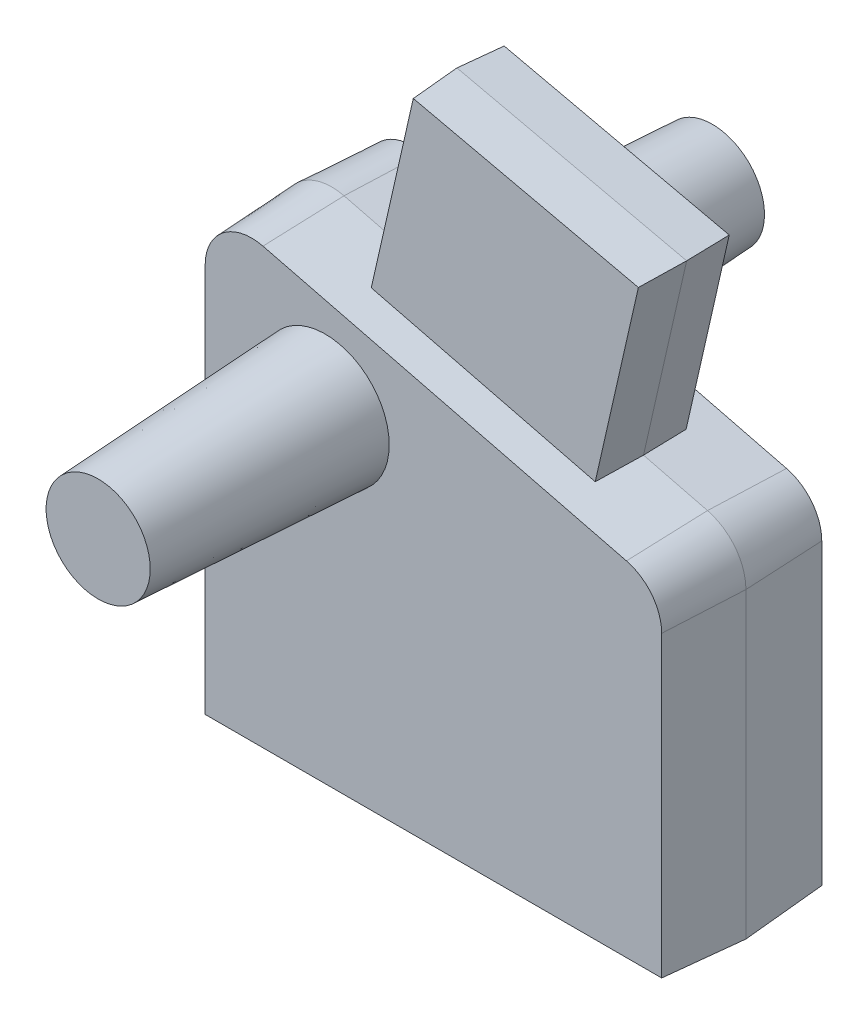
ISO-10303-21;
HEADER;
FILE_DESCRIPTION(('STEP AP214'),'2;1');
FILE_NAME('part.step','',(''),(''),'','','');
FILE_SCHEMA(('AUTOMOTIVE_DESIGN { 1 0 10303 214 1 1 1 1 }'));
ENDSEC;
DATA;
#1=APPLICATION_CONTEXT('core data for automotive mechanical design processes');
#2=APPLICATION_PROTOCOL_DEFINITION('international standard','automotive_design',2000,#1);
#3=PRODUCT_CONTEXT('',#1,'mechanical');
#4=PRODUCT('Part','Part','',(#3));
#5=PRODUCT_RELATED_PRODUCT_CATEGORY('part','',(#4));
#6=PRODUCT_DEFINITION_FORMATION('','',#4);
#7=PRODUCT_DEFINITION_CONTEXT('part definition',#1,'design');
#8=PRODUCT_DEFINITION('design','',#6,#7);
#9=PRODUCT_DEFINITION_SHAPE('','',#8);
#10=(LENGTH_UNIT() NAMED_UNIT(*) SI_UNIT(.MILLI.,.METRE.));
#11=(NAMED_UNIT(*) PLANE_ANGLE_UNIT() SI_UNIT($,.RADIAN.));
#12=(NAMED_UNIT(*) SI_UNIT($,.STERADIAN.) SOLID_ANGLE_UNIT());
#13=UNCERTAINTY_MEASURE_WITH_UNIT(LENGTH_MEASURE(1.E-05),#10,'distance_accuracy_value','');
#14=(GEOMETRIC_REPRESENTATION_CONTEXT(3) GLOBAL_UNCERTAINTY_ASSIGNED_CONTEXT((#13)) GLOBAL_UNIT_ASSIGNED_CONTEXT((#10,
#11,#12)) REPRESENTATION_CONTEXT('',''));
#15=CARTESIAN_POINT('',(0.,0.,0.));
#16=DIRECTION('',(0.,0.,1.));
#17=DIRECTION('',(1.,0.,0.));
#18=AXIS2_PLACEMENT_3D('',#15,#16,#17);
#19=CARTESIAN_POINT('',(-50.4827499814141,108.098826442577,0.));
#20=DIRECTION('',(0.,0.,1.));
#21=DIRECTION('',(1.,0.,0.));
#22=AXIS2_PLACEMENT_3D('',#19,#20,#21);
#23=PLANE('',#22);
#24=CARTESIAN_POINT('',(42.4472500185859,33.8201796404427,0.));
#25=DIRECTION('',(0.,0.,1.));
#26=DIRECTION('',(1.,0.,0.));
#27=AXIS2_PLACEMENT_3D('',#24,#25,#26);
#28=CIRCLE('',#27,11.8368516579048);
#29=CARTESIAN_POINT('',(45.3181082338981,45.303612501692,0.));
#30=VERTEX_POINT('',#29);
#31=CARTESIAN_POINT('',(54.2841016764907,33.8201796404427,0.));
#32=VERTEX_POINT('',#31);
#33=EDGE_CURVE('E131',#30,#32,#28,.F.);
#34=ORIENTED_EDGE('',*,*,#33,.F.);
#35=DIRECTION('',(0.970142500145332,-0.242535625036333,0.));
#36=VECTOR('',#35,1.);
#37=CARTESIAN_POINT('',(-19.8556972634542,61.59706387603,0.));
#38=LINE('',#37,#36);
#39=CARTESIAN_POINT('',(30.3785053743218,49.038513216586,0.));
#40=VERTEX_POINT('',#39);
#41=EDGE_CURVE('E142',#40,#30,#38,.T.);
#42=ORIENTED_EDGE('',*,*,#41,.F.);
#43=DIRECTION('',(-0.221621103588968,-0.97513285579146,0.));
#44=VECTOR('',#43,1.);
#45=CARTESIAN_POINT('',(25.7221320791216,28.550470717705,0.));
#46=LINE('',#45,#44);
#47=CARTESIAN_POINT('',(40.450684504197,93.3561013880368,0.));
#48=VERTEX_POINT('',#47);
#49=EDGE_CURVE('E103',#48,#40,#46,.T.);
#50=ORIENTED_EDGE('',*,*,#49,.F.);
#51=DIRECTION('',(0.97513285579146,-0.221621103588968,0.));
#52=VECTOR('',#51,1.);
#53=CARTESIAN_POINT('',(-10.4941975563387,104.934483674522,0.));
#54=LINE('',#53,#52);
#55=CARTESIAN_POINT('',(-13.1657311321388,105.541650396295,0.));
#56=VERTEX_POINT('',#55);
#57=EDGE_CURVE('E104',#56,#48,#54,.T.);
#58=ORIENTED_EDGE('',*,*,#57,.F.);
#59=DIRECTION('',(0.221621103588968,0.97513285579146,0.));
#60=VECTOR('',#59,1.);
#61=CARTESIAN_POINT('',(-27.8942835572142,40.7360197259632,0.));
#62=LINE('',#61,#60);
#63=CARTESIAN_POINT('',(-22.9758554446321,62.3771034213245,0.));
#64=VERTEX_POINT('',#63);
#65=EDGE_CURVE('E56',#64,#56,#62,.T.);
#66=ORIENTED_EDGE('',*,*,#65,.F.);
#67=DIRECTION('',(0.970142500145332,-0.242535625036333,0.));
#68=VECTOR('',#67,1.);
#69=CARTESIAN_POINT('',(-19.8556972634542,61.59706387603,0.));
#70=LINE('',#69,#68);
#71=CARTESIAN_POINT('',(-39.5218917661017,66.5136125016919,0.));
#72=VERTEX_POINT('',#71);
#73=EDGE_CURVE('E135',#72,#64,#70,.T.);
#74=ORIENTED_EDGE('',*,*,#73,.F.);
#75=CARTESIAN_POINT('',(-42.3927499814141,55.0301796404427,0.));
#76=DIRECTION('',(0.,0.,1.));
#77=DIRECTION('',(1.,0.,0.));
#78=AXIS2_PLACEMENT_3D('',#75,#76,#77);
#79=CIRCLE('',#78,11.8368516579048);
#80=CARTESIAN_POINT('',(-54.2296016393189,55.0301796404426,0.));
#81=VERTEX_POINT('',#80);
#82=EDGE_CURVE('E150',#81,#72,#79,.F.);
#83=ORIENTED_EDGE('',*,*,#82,.F.);
#84=DIRECTION('',(0.,1.,0.));
#85=VECTOR('',#84,1.);
#86=CARTESIAN_POINT('',(-54.2296016393189,40.1288530041904,0.));
#87=LINE('',#86,#85);
#88=CARTESIAN_POINT('',(-54.2296016393189,-36.8279986537144,0.));
#89=VERTEX_POINT('',#88);
#90=EDGE_CURVE('E248',#89,#81,#87,.T.);
#91=ORIENTED_EDGE('',*,*,#90,.F.);
#92=DIRECTION('',(-1.,0.,0.));
#93=VECTOR('',#92,1.);
#94=CARTESIAN_POINT('',(-25.2227499814141,-36.8279986537144,0.));
#95=LINE('',#94,#93);
#96=CARTESIAN_POINT('',(54.2841016764907,-36.8279986537144,0.));
#97=VERTEX_POINT('',#96);
#98=EDGE_CURVE('E250',#97,#89,#95,.T.);
#99=ORIENTED_EDGE('',*,*,#98,.F.);
#100=DIRECTION('',(0.,-1.,0.));
#101=VECTOR('',#100,1.);
#102=CARTESIAN_POINT('',(54.2841016764907,40.1288530041904,0.));
#103=LINE('',#102,#101);
#104=EDGE_CURVE('E146',#32,#97,#103,.T.);
#105=ORIENTED_EDGE('',*,*,#104,.F.);
#106=EDGE_LOOP('',(#34,#42,#50,#58,#66,#74,#83,#91,#99,#105));
#107=FACE_BOUND('',#106,.T.);
#108=ADVANCED_FACE('F52',(#107),#23,.T.);
#109=CARTESIAN_POINT('',(-25.2227499814141,40.1288530041904,-71.685));
#110=DIRECTION('',(0.,0.,-1.));
#111=DIRECTION('',(-1.,0.,0.));
#112=AXIS2_PLACEMENT_3D('',#109,#110,#111);
#113=PLANE('',#112);
#114=CARTESIAN_POINT('',(-25.2227499814141,40.1288530041904,-71.685));
#115=DIRECTION('',(0.,0.,-1.));
#116=DIRECTION('',(-1.,0.,0.));
#117=AXIS2_PLACEMENT_3D('',#114,#115,#116);
#118=CIRCLE('',#117,12.15);
#119=CARTESIAN_POINT('',(-37.3727499814141,40.1288530041904,-71.685));
#120=VERTEX_POINT('',#119);
#121=EDGE_CURVE('E13',#120,#120,#118,.T.);
#122=ORIENTED_EDGE('',*,*,#121,.T.);
#123=EDGE_LOOP('',(#122));
#124=FACE_BOUND('',#123,.T.);
#125=ADVANCED_FACE('F181',(#124),#113,.T.);
#126=CARTESIAN_POINT('',(-25.2227499814141,40.1288530041904,-71.685));
#127=DIRECTION('',(0.,0.,1.));
#128=DIRECTION('',(-1.,0.,0.));
#129=AXIS2_PLACEMENT_3D('',#126,#127,#128);
#130=CONICAL_SURFACE('',#129,12.15,0.05235987755983);
#131=CARTESIAN_POINT('',(-25.2227499814141,40.1288530041904,-18.685));
#132=DIRECTION('',(0.,0.,1.));
#133=DIRECTION('',(1.,0.,0.));
#134=AXIS2_PLACEMENT_3D('',#131,#132,#133);
#135=CIRCLE('',#134,14.9276123020012);
#136=CARTESIAN_POINT('',(-10.2951376794129,40.1288530041904,-18.685));
#137=VERTEX_POINT('',#136);
#138=EDGE_CURVE('E126',#137,#137,#135,.T.);
#139=ORIENTED_EDGE('',*,*,#138,.F.);
#140=EDGE_LOOP('',(#139));
#141=FACE_BOUND('',#140,.T.);
#142=ORIENTED_EDGE('',*,*,#121,.F.);
#143=EDGE_LOOP('',(#142));
#144=FACE_BOUND('',#143,.T.);
#145=ADVANCED_FACE('F178',(#141,#144),#130,.T.);
#146=CARTESIAN_POINT('',(-11.3267951667836,101.271054188565,-71.685));
#147=DIRECTION('',(0.221317379568847,0.973796470102924,-0.0523359562429439));
#148=DIRECTION('',(-0.97513285579146,0.221621103588968,0.));
#149=AXIS2_PLACEMENT_3D('',#146,#147,#148);
#150=PLANE('',#149);
#151=DIRECTION('',(-0.0393818604855833,0.0625476607712206,0.997264688634237));
#152=VECTOR('',#151,1.);
#153=CARTESIAN_POINT('',(-10.3369929097927,101.048948513745,-71.6319825359308));
#154=LINE('',#153,#152);
#155=CARTESIAN_POINT('',(-12.7469409802268,104.876513096199,-10.605));
#156=VERTEX_POINT('',#155);
#157=EDGE_CURVE('E100',#156,#56,#154,.T.);
#158=ORIENTED_EDGE('',*,*,#157,.T.);
#159=ORIENTED_EDGE('',*,*,#57,.T.);
#160=DIRECTION('',(-0.0625476607712206,-0.0393818604855833,-0.997264688634237));
#161=VECTOR('',#160,1.);
#162=CARTESIAN_POINT('',(35.7961519240324,90.4254697634888,-74.2122235597905));
#163=LINE('',#162,#161);
#164=CARTESIAN_POINT('',(39.7855472041015,92.9373112361248,-10.605));
#165=VERTEX_POINT('',#164);
#166=EDGE_CURVE('E62',#48,#165,#163,.T.);
#167=ORIENTED_EDGE('',*,*,#166,.T.);
#168=DIRECTION('',(-0.97513285579146,0.221621103588968,0.));
#169=VECTOR('',#168,1.);
#170=CARTESIAN_POINT('',(-10.6173711304304,104.392519948518,-10.605));
#171=LINE('',#170,#169);
#172=EDGE_CURVE('E112',#165,#156,#171,.T.);
#173=ORIENTED_EDGE('',*,*,#172,.T.);
#174=EDGE_LOOP('',(#158,#159,#167,#173));
#175=FACE_BOUND('',#174,.T.);
#176=ADVANCED_FACE('F54',(#175),#150,.T.);
#177=CARTESIAN_POINT('',(22.058702593164,29.3830683281499,-71.685));
#178=DIRECTION('',(0.973796470102924,-0.221317379568847,-0.0523359562429439));
#179=DIRECTION('',(0.221621103588968,0.97513285579146,0.));
#180=AXIS2_PLACEMENT_3D('',#177,#178,#179);
#181=PLANE('',#180);
#182=ORIENTED_EDGE('',*,*,#166,.F.);
#183=ORIENTED_EDGE('',*,*,#49,.T.);
#184=DIRECTION('',(0.0623048265116967,0.0382998299512794,0.997322030047993));
#185=VECTOR('',#184,1.);
#186=CARTESIAN_POINT('',(25.8449449039895,46.2516569678976,-72.5693334651749));
#187=LINE('',#186,#185);
#188=CARTESIAN_POINT('',(29.7159884888533,48.6312528890329,-10.605));
#189=VERTEX_POINT('',#188);
#190=EDGE_CURVE('E127',#189,#40,#187,.T.);
#191=ORIENTED_EDGE('',*,*,#190,.F.);
#192=DIRECTION('',(0.221621103588968,0.97513285579146,0.));
#193=VECTOR('',#192,1.);
#194=CARTESIAN_POINT('',(25.1801683531178,28.6736442917968,-10.605));
#195=LINE('',#194,#193);
#196=EDGE_CURVE('E116',#189,#165,#195,.T.);
#197=ORIENTED_EDGE('',*,*,#196,.T.);
#198=EDGE_LOOP('',(#182,#183,#191,#197));
#199=FACE_BOUND('',#198,.T.);
#200=ADVANCED_FACE('F196',(#199),#181,.T.);
#201=CARTESIAN_POINT('',(-31.800306609227,6.59783094844859,-10.605));
#202=DIRECTION('',(0.,0.,-1.));
#203=DIRECTION('',(-1.,0.,0.));
#204=AXIS2_PLACEMENT_3D('',#201,#202,#203);
#205=PLANE('',#204);
#206=DIRECTION('',(0.970142500145332,-0.242535625036333,0.));
#207=VECTOR('',#206,1.);
#208=CARTESIAN_POINT('',(-18.291484088026,60.6331210332527,-10.605));
#209=LINE('',#208,#207);
#210=CARTESIAN_POINT('',(-22.559742666226,61.7001856778027,-10.605));
#211=VERTEX_POINT('',#210);
#212=EDGE_CURVE('E122',#211,#189,#209,.T.);
#213=ORIENTED_EDGE('',*,*,#212,.F.);
#214=DIRECTION('',(0.221621103588968,0.97513285579146,0.));
#215=VECTOR('',#214,1.);
#216=CARTESIAN_POINT('',(-34.9217723691808,7.30725498480173,-10.605));
#217=LINE('',#216,#215);
#218=EDGE_CURVE('E113',#211,#156,#217,.T.);
#219=ORIENTED_EDGE('',*,*,#218,.T.);
#220=ORIENTED_EDGE('',*,*,#172,.F.);
#221=ORIENTED_EDGE('',*,*,#196,.F.);
#222=EDGE_LOOP('',(#213,#219,#220,#221));
#223=FACE_BOUND('',#222,.T.);
#224=ADVANCED_FACE('F193',(#223),#205,.T.);
#225=CARTESIAN_POINT('',(-24.2308540712566,39.9034221155183,-71.685));
#226=DIRECTION('',(-0.973796470102925,0.221317379568847,-0.0523359562429439));
#227=DIRECTION('',(-0.221621103588968,-0.97513285579146,0.));
#228=AXIS2_PLACEMENT_3D('',#225,#226,#227);
#229=PLANE('',#228);
#230=DIRECTION('',(0.0391277393421956,-0.0636516406107164,-0.997204837865087));
#231=VECTOR('',#230,1.);
#232=CARTESIAN_POINT('',(-20.12477318949,57.7390623254979,-72.6623379161843));
#233=LINE('',#232,#231);
#234=EDGE_CURVE('E71',#64,#211,#233,.T.);
#235=ORIENTED_EDGE('',*,*,#234,.F.);
#236=ORIENTED_EDGE('',*,*,#65,.T.);
#237=ORIENTED_EDGE('',*,*,#157,.F.);
#238=ORIENTED_EDGE('',*,*,#218,.F.);
#239=EDGE_LOOP('',(#235,#236,#237,#238));
#240=FACE_BOUND('',#239,.T.);
#241=ADVANCED_FACE('F98',(#240),#229,.T.);
#242=CARTESIAN_POINT('',(-20.7668676284729,57.9523824159551,-71.685));
#243=DIRECTION('',(0.242203238391443,0.968812953565772,-0.0523359562429439));
#244=DIRECTION('',(-0.970142500145332,0.242535625036333,0.));
#245=AXIS2_PLACEMENT_3D('',#242,#243,#244);
#246=PLANE('',#245);
#247=DIRECTION('',(0.0126933338592566,0.0507733354370263,0.998629534754574));
#248=VECTOR('',#247,1.);
#249=CARTESIAN_POINT('',(-40.4330621311204,62.868931041617,-71.685));
#250=LINE('',#249,#248);
#251=CARTESIAN_POINT('',(-39.759392195346,65.5636107847149,-18.685));
#252=VERTEX_POINT('',#251);
#253=EDGE_CURVE('E155',#252,#72,#250,.T.);
#254=ORIENTED_EDGE('',*,*,#253,.T.);
#255=ORIENTED_EDGE('',*,*,#73,.T.);
#256=ORIENTED_EDGE('',*,*,#234,.T.);
#257=ORIENTED_EDGE('',*,*,#212,.T.);
#258=ORIENTED_EDGE('',*,*,#190,.T.);
#259=ORIENTED_EDGE('',*,*,#41,.T.);
#260=DIRECTION('',(0.0126933338592563,0.0507733354370264,0.998629534754574));
#261=VECTOR('',#260,1.);
#262=CARTESIAN_POINT('',(44.4069378688794,41.658931041617,-71.685));
#263=LINE('',#262,#261);
#264=CARTESIAN_POINT('',(45.0806078046539,44.3536107847149,-18.685));
#265=VERTEX_POINT('',#264);
#266=EDGE_CURVE('E121',#265,#30,#263,.T.);
#267=ORIENTED_EDGE('',*,*,#266,.F.);
#268=DIRECTION('',(-0.970142500145332,0.242535625036333,0.));
#269=VECTOR('',#268,1.);
#270=CARTESIAN_POINT('',(-39.7593921953461,65.5636107847149,-18.685));
#271=LINE('',#270,#269);
#272=EDGE_CURVE('E130',#265,#252,#271,.T.);
#273=ORIENTED_EDGE('',*,*,#272,.T.);
#274=EDGE_LOOP('',(#254,#255,#256,#257,#258,#259,#267,#273));
#275=FACE_BOUND('',#274,.T.);
#276=ADVANCED_FACE('F206',(#275),#246,.T.);
#277=CARTESIAN_POINT('',(-42.3927499814141,55.0301796404427,-71.685));
#278=DIRECTION('',(0.,0.,1.));
#279=DIRECTION('',(-1.,0.,0.));
#280=AXIS2_PLACEMENT_3D('',#277,#278,#279);
#281=CONICAL_SURFACE('',#280,8.08,0.05235987755983);
#282=DIRECTION('',(-0.0523359562429439,0.,0.998629534754574));
#283=VECTOR('',#282,1.);
#284=CARTESIAN_POINT('',(-50.4727499814141,55.0301796404427,-71.685));
#285=LINE('',#284,#283);
#286=CARTESIAN_POINT('',(-53.2503622834153,55.0301796404426,-18.685));
#287=VERTEX_POINT('',#286);
#288=EDGE_CURVE('E156',#287,#81,#285,.T.);
#289=ORIENTED_EDGE('',*,*,#288,.T.);
#290=ORIENTED_EDGE('',*,*,#82,.T.);
#291=ORIENTED_EDGE('',*,*,#253,.F.);
#292=CARTESIAN_POINT('',(-42.3927499814141,55.0301796404427,-18.685));
#293=DIRECTION('',(0.,0.,1.));
#294=DIRECTION('',(1.,0.,0.));
#295=AXIS2_PLACEMENT_3D('',#292,#293,#294);
#296=CIRCLE('',#295,10.8576123020012);
#297=EDGE_CURVE('E152',#252,#287,#296,.T.);
#298=ORIENTED_EDGE('',*,*,#297,.T.);
#299=EDGE_LOOP('',(#289,#290,#291,#298));
#300=FACE_BOUND('',#299,.T.);
#301=ADVANCED_FACE('F203',(#300),#281,.T.);
#302=CARTESIAN_POINT('',(-50.4727499814141,40.1288530041904,-71.685));
#303=DIRECTION('',(-0.998629534754574,0.,-0.0523359562429439));
#304=DIRECTION('',(-0.052335956242944,0.,0.998629534754574));
#305=AXIS2_PLACEMENT_3D('',#302,#303,#304);
#306=PLANE('',#305);
#307=DIRECTION('',(0.052264427688714,0.0522644276887141,-0.997264688634237));
#308=VECTOR('',#307,1.);
#309=CARTESIAN_POINT('',(-50.403777828773,-33.0021748431684,-73.0010670721922));
#310=LINE('',#309,#308);
#311=CARTESIAN_POINT('',(-53.2503622834153,-35.8487592978108,-18.685));
#312=VERTEX_POINT('',#311);
#313=EDGE_CURVE('E165',#89,#312,#310,.T.);
#314=ORIENTED_EDGE('',*,*,#313,.F.);
#315=ORIENTED_EDGE('',*,*,#90,.T.);
#316=ORIENTED_EDGE('',*,*,#288,.F.);
#317=DIRECTION('',(0.,-1.,0.));
#318=VECTOR('',#317,1.);
#319=CARTESIAN_POINT('',(-53.2503622834153,55.0301796404427,-18.685));
#320=LINE('',#319,#318);
#321=EDGE_CURVE('E170',#287,#312,#320,.T.);
#322=ORIENTED_EDGE('',*,*,#321,.T.);
#323=EDGE_LOOP('',(#314,#315,#316,#322));
#324=FACE_BOUND('',#323,.T.);
#325=ADVANCED_FACE('F200',(#324),#306,.T.);
#326=CARTESIAN_POINT('',(-42.3927499814141,55.0301796404427,-18.685));
#327=DIRECTION('',(0.,0.,1.));
#328=DIRECTION('',(1.,0.,0.));
#329=AXIS2_PLACEMENT_3D('',#326,#327,#328);
#330=PLANE('',#329);
#331=DIRECTION('',(0.,1.,0.));
#332=VECTOR('',#331,1.);
#333=CARTESIAN_POINT('',(53.3048623205871,55.0301796404428,-18.685));
#334=LINE('',#333,#332);
#335=CARTESIAN_POINT('',(53.3048623205871,-35.8487592978107,-18.685));
#336=VERTEX_POINT('',#335);
#337=CARTESIAN_POINT('',(53.3048623205871,33.8201796404427,-18.685));
#338=VERTEX_POINT('',#337);
#339=EDGE_CURVE('E162',#336,#338,#334,.T.);
#340=ORIENTED_EDGE('',*,*,#339,.F.);
#341=DIRECTION('',(1.,0.,0.));
#342=VECTOR('',#341,1.);
#343=CARTESIAN_POINT('',(-42.3927499814141,-35.8487592978108,-18.685));
#344=LINE('',#343,#342);
#345=EDGE_CURVE('E167',#312,#336,#344,.T.);
#346=ORIENTED_EDGE('',*,*,#345,.F.);
#347=ORIENTED_EDGE('',*,*,#321,.F.);
#348=ORIENTED_EDGE('',*,*,#297,.F.);
#349=ORIENTED_EDGE('',*,*,#272,.F.);
#350=CARTESIAN_POINT('',(42.4472500185859,33.8201796404427,-18.685));
#351=DIRECTION('',(0.,0.,1.));
#352=DIRECTION('',(1.,0.,0.));
#353=AXIS2_PLACEMENT_3D('',#350,#351,#352);
#354=CIRCLE('',#353,10.8576123020012);
#355=EDGE_CURVE('E159',#338,#265,#354,.T.);
#356=ORIENTED_EDGE('',*,*,#355,.F.);
#357=EDGE_LOOP('',(#340,#346,#347,#348,#349,#356));
#358=FACE_BOUND('',#357,.T.);
#359=ORIENTED_EDGE('',*,*,#138,.T.);
#360=EDGE_LOOP('',(#359));
#361=FACE_BOUND('',#360,.T.);
#362=ADVANCED_FACE('F176',(#358,#361),#330,.F.);
#363=CARTESIAN_POINT('',(-25.2227499814141,-33.0711469958096,-71.685));
#364=DIRECTION('',(0.,-0.998629534754574,-0.0523359562429439));
#365=DIRECTION('',(0.,0.052335956242944,-0.998629534754574));
#366=AXIS2_PLACEMENT_3D('',#363,#364,#365);
#367=PLANE('',#366);
#368=DIRECTION('',(0.0522644276887141,-0.052264427688714,0.997264688634237));
#369=VECTOR('',#368,1.);
#370=CARTESIAN_POINT('',(50.3203335606626,-32.8642305378862,-75.6332012165766));
#371=LINE('',#370,#369);
#372=EDGE_CURVE('E171',#336,#97,#371,.T.);
#373=ORIENTED_EDGE('',*,*,#372,.T.);
#374=ORIENTED_EDGE('',*,*,#98,.T.);
#375=ORIENTED_EDGE('',*,*,#313,.T.);
#376=ORIENTED_EDGE('',*,*,#345,.T.);
#377=EDGE_LOOP('',(#373,#374,#375,#376));
#378=FACE_BOUND('',#377,.T.);
#379=ADVANCED_FACE('F199',(#378),#367,.T.);
#380=CARTESIAN_POINT('',(42.4472500185859,33.8201796404427,-71.685));
#381=DIRECTION('',(0.,0.,1.));
#382=DIRECTION('',(-1.,0.,0.));
#383=AXIS2_PLACEMENT_3D('',#380,#381,#382);
#384=CONICAL_SURFACE('',#383,8.08,0.05235987755983);
#385=ORIENTED_EDGE('',*,*,#266,.T.);
#386=ORIENTED_EDGE('',*,*,#33,.T.);
#387=DIRECTION('',(0.0523359562429439,0.,0.998629534754574));
#388=VECTOR('',#387,1.);
#389=CARTESIAN_POINT('',(50.5272500185859,33.8201796404427,-71.685));
#390=LINE('',#389,#388);
#391=EDGE_CURVE('E166',#338,#32,#390,.T.);
#392=ORIENTED_EDGE('',*,*,#391,.F.);
#393=ORIENTED_EDGE('',*,*,#355,.T.);
#394=EDGE_LOOP('',(#385,#386,#392,#393));
#395=FACE_BOUND('',#394,.T.);
#396=ADVANCED_FACE('F208',(#395),#384,.T.);
#397=CARTESIAN_POINT('',(50.5272500185859,40.1288530041904,-71.685));
#398=DIRECTION('',(0.998629534754574,0.,-0.0523359562429439));
#399=DIRECTION('',(-0.052335956242944,0.,-0.998629534754574));
#400=AXIS2_PLACEMENT_3D('',#397,#398,#399);
#401=PLANE('',#400);
#402=ORIENTED_EDGE('',*,*,#391,.T.);
#403=ORIENTED_EDGE('',*,*,#104,.T.);
#404=ORIENTED_EDGE('',*,*,#372,.F.);
#405=ORIENTED_EDGE('',*,*,#339,.T.);
#406=EDGE_LOOP('',(#402,#403,#404,#405));
#407=FACE_BOUND('',#406,.T.);
#408=ADVANCED_FACE('F191',(#407),#401,.T.);
#409=CLOSED_SHELL('',(#108,#125,#145,#176,#200,#224,#241,#276,#301,#325,#362,#379,#396,#408));
#410=MANIFOLD_SOLID_BREP('B2',#409);
#411=CARTESIAN_POINT('',(-50.4827499814141,108.098826442577,0.));
#412=DIRECTION('',(0.,0.,1.));
#413=DIRECTION('',(1.,0.,0.));
#414=AXIS2_PLACEMENT_3D('',#411,#412,#413);
#415=PLANE('',#414);
#416=CARTESIAN_POINT('',(42.4472500185859,33.8201796404427,0.));
#417=DIRECTION('',(0.,0.,1.));
#418=DIRECTION('',(1.,0.,0.));
#419=AXIS2_PLACEMENT_3D('',#416,#417,#418);
#420=CIRCLE('',#419,11.8368516579048);
#421=CARTESIAN_POINT('',(45.3181082338981,45.303612501692,0.));
#422=VERTEX_POINT('',#421);
#423=CARTESIAN_POINT('',(54.2841016764907,33.8201796404427,0.));
#424=VERTEX_POINT('',#423);
#425=EDGE_CURVE('E551',#422,#424,#420,.F.);
#426=ORIENTED_EDGE('',*,*,#425,.T.);
#427=DIRECTION('',(0.,-1.,0.));
#428=VECTOR('',#427,1.);
#429=CARTESIAN_POINT('',(54.2841016764907,40.1288530041904,0.));
#430=LINE('',#429,#428);
#431=CARTESIAN_POINT('',(54.2841016764907,-36.8279986537144,0.));
#432=VERTEX_POINT('',#431);
#433=EDGE_CURVE('E50',#424,#432,#430,.T.);
#434=ORIENTED_EDGE('',*,*,#433,.T.);
#435=DIRECTION('',(-1.,0.,0.));
#436=VECTOR('',#435,1.);
#437=CARTESIAN_POINT('',(-25.2227499814141,-36.8279986537144,0.));
#438=LINE('',#437,#436);
#439=CARTESIAN_POINT('',(-54.2296016393189,-36.8279986537144,0.));
#440=VERTEX_POINT('',#439);
#441=EDGE_CURVE('E416',#432,#440,#438,.T.);
#442=ORIENTED_EDGE('',*,*,#441,.T.);
#443=DIRECTION('',(0.,1.,0.));
#444=VECTOR('',#443,1.);
#445=CARTESIAN_POINT('',(-54.2296016393189,40.1288530041904,0.));
#446=LINE('',#445,#444);
#447=CARTESIAN_POINT('',(-54.2296016393189,55.0301796404426,0.));
#448=VERTEX_POINT('',#447);
#449=EDGE_CURVE('E570',#440,#448,#446,.T.);
#450=ORIENTED_EDGE('',*,*,#449,.T.);
#451=CARTESIAN_POINT('',(-42.3927499814141,55.0301796404427,0.));
#452=DIRECTION('',(0.,0.,1.));
#453=DIRECTION('',(1.,0.,0.));
#454=AXIS2_PLACEMENT_3D('',#451,#452,#453);
#455=CIRCLE('',#454,11.8368516579048);
#456=CARTESIAN_POINT('',(-39.5218917661017,66.5136125016919,0.));
#457=VERTEX_POINT('',#456);
#458=EDGE_CURVE('E573',#448,#457,#455,.F.);
#459=ORIENTED_EDGE('',*,*,#458,.T.);
#460=DIRECTION('',(0.970142500145332,-0.242535625036333,0.));
#461=VECTOR('',#460,1.);
#462=CARTESIAN_POINT('',(-19.8556972634542,61.59706387603,0.));
#463=LINE('',#462,#461);
#464=CARTESIAN_POINT('',(-22.9758554446321,62.3771034213245,0.));
#465=VERTEX_POINT('',#464);
#466=EDGE_CURVE('E576',#457,#465,#463,.T.);
#467=ORIENTED_EDGE('',*,*,#466,.T.);
#468=DIRECTION('',(0.221621103588968,0.97513285579146,0.));
#469=VECTOR('',#468,1.);
#470=CARTESIAN_POINT('',(-27.8942835572142,40.7360197259632,0.));
#471=LINE('',#470,#469);
#472=CARTESIAN_POINT('',(-13.1657311321388,105.541650396295,0.));
#473=VERTEX_POINT('',#472);
#474=EDGE_CURVE('E500',#465,#473,#471,.T.);
#475=ORIENTED_EDGE('',*,*,#474,.T.);
#476=DIRECTION('',(0.97513285579146,-0.221621103588968,0.));
#477=VECTOR('',#476,1.);
#478=CARTESIAN_POINT('',(-10.4941975563387,104.934483674522,0.));
#479=LINE('',#478,#477);
#480=CARTESIAN_POINT('',(40.450684504197,93.3561013880368,0.));
#481=VERTEX_POINT('',#480);
#482=EDGE_CURVE('E519',#473,#481,#479,.T.);
#483=ORIENTED_EDGE('',*,*,#482,.T.);
#484=DIRECTION('',(-0.221621103588968,-0.97513285579146,0.));
#485=VECTOR('',#484,1.);
#486=CARTESIAN_POINT('',(25.7221320791216,28.550470717705,0.));
#487=LINE('',#486,#485);
#488=CARTESIAN_POINT('',(30.3785053743218,49.038513216586,0.));
#489=VERTEX_POINT('',#488);
#490=EDGE_CURVE('E508',#481,#489,#487,.T.);
#491=ORIENTED_EDGE('',*,*,#490,.T.);
#492=DIRECTION('',(0.970142500145332,-0.242535625036333,0.));
#493=VECTOR('',#492,1.);
#494=CARTESIAN_POINT('',(-19.8556972634542,61.59706387603,0.));
#495=LINE('',#494,#493);
#496=EDGE_CURVE('E577',#489,#422,#495,.T.);
#497=ORIENTED_EDGE('',*,*,#496,.T.);
#498=EDGE_LOOP('',(#426,#434,#442,#450,#459,#467,#475,#483,#491,#497));
#499=FACE_BOUND('',#498,.T.);
#500=ADVANCED_FACE('F406',(#499),#415,.F.);
#501=CARTESIAN_POINT('',(-11.3267951667836,101.271054188565,71.685));
#502=DIRECTION('',(0.221317379568847,0.973796470102924,0.0523359562429439));
#503=DIRECTION('',(-0.97513285579146,0.221621103588968,0.));
#504=AXIS2_PLACEMENT_3D('',#501,#502,#503);
#505=PLANE('',#504);
#506=ORIENTED_EDGE('',*,*,#482,.F.);
#507=DIRECTION('',(0.0393818604855833,-0.0625476607712206,0.997264688634237));
#508=VECTOR('',#507,1.);
#509=CARTESIAN_POINT('',(-10.3369929097927,101.048948513745,71.6319825359308));
#510=LINE('',#509,#508);
#511=CARTESIAN_POINT('',(-12.7469409802268,104.876513096199,10.605));
#512=VERTEX_POINT('',#511);
#513=EDGE_CURVE('E496',#473,#512,#510,.T.);
#514=ORIENTED_EDGE('',*,*,#513,.T.);
#515=DIRECTION('',(0.97513285579146,-0.221621103588968,0.));
#516=VECTOR('',#515,1.);
#517=CARTESIAN_POINT('',(-10.6173711304304,104.392519948518,10.605));
#518=LINE('',#517,#516);
#519=CARTESIAN_POINT('',(39.7855472041015,92.9373112361248,10.605));
#520=VERTEX_POINT('',#519);
#521=EDGE_CURVE('E492',#512,#520,#518,.T.);
#522=ORIENTED_EDGE('',*,*,#521,.T.);
#523=DIRECTION('',(0.0625476607712206,0.0393818604855833,-0.997264688634237));
#524=VECTOR('',#523,1.);
#525=CARTESIAN_POINT('',(35.7961519240324,90.4254697634888,74.2122235597905));
#526=LINE('',#525,#524);
#527=EDGE_CURVE('E511',#520,#481,#526,.T.);
#528=ORIENTED_EDGE('',*,*,#527,.T.);
#529=EDGE_LOOP('',(#506,#514,#522,#528));
#530=FACE_BOUND('',#529,.T.);
#531=ADVANCED_FACE('F408',(#530),#505,.T.);
#532=CARTESIAN_POINT('',(-24.2308540712566,39.9034221155183,71.685));
#533=DIRECTION('',(-0.973796470102925,0.221317379568847,0.0523359562429439));
#534=DIRECTION('',(-0.221621103588968,-0.97513285579146,0.));
#535=AXIS2_PLACEMENT_3D('',#532,#533,#534);
#536=PLANE('',#535);
#537=ORIENTED_EDGE('',*,*,#474,.F.);
#538=DIRECTION('',(-0.0391277393421956,0.0636516406107164,-0.997204837865087));
#539=VECTOR('',#538,1.);
#540=CARTESIAN_POINT('',(-20.12477318949,57.7390623254979,72.6623379161843));
#541=LINE('',#540,#539);
#542=CARTESIAN_POINT('',(-22.559742666226,61.7001856778027,10.605));
#543=VERTEX_POINT('',#542);
#544=EDGE_CURVE('E410',#543,#465,#541,.T.);
#545=ORIENTED_EDGE('',*,*,#544,.F.);
#546=DIRECTION('',(0.221621103588968,0.97513285579146,0.));
#547=VECTOR('',#546,1.);
#548=CARTESIAN_POINT('',(-27.3523198312104,40.6128461518714,10.605));
#549=LINE('',#548,#547);
#550=EDGE_CURVE('E489',#543,#512,#549,.T.);
#551=ORIENTED_EDGE('',*,*,#550,.T.);
#552=ORIENTED_EDGE('',*,*,#513,.F.);
#553=EDGE_LOOP('',(#537,#545,#551,#552));
#554=FACE_BOUND('',#553,.T.);
#555=ADVANCED_FACE('F498',(#554),#536,.T.);
#556=CARTESIAN_POINT('',(22.058702593164,29.3830683281499,71.685));
#557=DIRECTION('',(0.973796470102924,-0.221317379568847,0.0523359562429439));
#558=DIRECTION('',(0.221621103588968,0.97513285579146,0.));
#559=AXIS2_PLACEMENT_3D('',#556,#557,#558);
#560=PLANE('',#559);
#561=ORIENTED_EDGE('',*,*,#490,.F.);
#562=ORIENTED_EDGE('',*,*,#527,.F.);
#563=DIRECTION('',(0.221621103588968,0.97513285579146,0.));
#564=VECTOR('',#563,1.);
#565=CARTESIAN_POINT('',(17.6107158151474,-4.63194687527288,10.605));
#566=LINE('',#565,#564);
#567=CARTESIAN_POINT('',(29.7159884888533,48.6312528890329,10.605));
#568=VERTEX_POINT('',#567);
#569=EDGE_CURVE('E495',#568,#520,#566,.T.);
#570=ORIENTED_EDGE('',*,*,#569,.F.);
#571=DIRECTION('',(-0.0623048265116967,-0.0382998299512794,0.997322030047993));
#572=VECTOR('',#571,1.);
#573=CARTESIAN_POINT('',(25.8449449039895,46.2516569678976,72.5693334651749));
#574=LINE('',#573,#572);
#575=EDGE_CURVE('E482',#489,#568,#574,.T.);
#576=ORIENTED_EDGE('',*,*,#575,.F.);
#577=EDGE_LOOP('',(#561,#562,#570,#576));
#578=FACE_BOUND('',#577,.T.);
#579=ADVANCED_FACE('F597',(#578),#560,.T.);
#580=CARTESIAN_POINT('',(-31.800306609227,6.59783094844859,10.605));
#581=DIRECTION('',(0.,0.,1.));
#582=DIRECTION('',(1.,0.,0.));
#583=AXIS2_PLACEMENT_3D('',#580,#581,#582);
#584=PLANE('',#583);
#585=DIRECTION('',(-0.970142500145332,0.242535625036333,0.));
#586=VECTOR('',#585,1.);
#587=CARTESIAN_POINT('',(-18.291484088026,60.6331210332527,10.605));
#588=LINE('',#587,#586);
#589=EDGE_CURVE('E476',#568,#543,#588,.T.);
#590=ORIENTED_EDGE('',*,*,#589,.F.);
#591=ORIENTED_EDGE('',*,*,#569,.T.);
#592=ORIENTED_EDGE('',*,*,#521,.F.);
#593=ORIENTED_EDGE('',*,*,#550,.F.);
#594=EDGE_LOOP('',(#590,#591,#592,#593));
#595=FACE_BOUND('',#594,.T.);
#596=ADVANCED_FACE('F490',(#595),#584,.T.);
#597=CARTESIAN_POINT('',(42.4472500185859,33.8201796404427,71.685));
#598=DIRECTION('',(0.,0.,-1.));
#599=DIRECTION('',(1.,0.,0.));
#600=AXIS2_PLACEMENT_3D('',#597,#598,#599);
#601=CONICAL_SURFACE('',#600,8.08,0.05235987755983);
#602=ORIENTED_EDGE('',*,*,#425,.F.);
#603=DIRECTION('',(0.0126933338592562,0.0507733354370264,-0.998629534754574));
#604=VECTOR('',#603,1.);
#605=CARTESIAN_POINT('',(44.4069378688794,41.658931041617,71.685));
#606=LINE('',#605,#604);
#607=CARTESIAN_POINT('',(45.0806078046539,44.3536107847149,18.685));
#608=VERTEX_POINT('',#607);
#609=EDGE_CURVE('E485',#422,#608,#606,.F.);
#610=ORIENTED_EDGE('',*,*,#609,.T.);
#611=CARTESIAN_POINT('',(42.4472500185859,33.8201796404427,18.685));
#612=DIRECTION('',(0.,0.,1.));
#613=DIRECTION('',(1.,0.,0.));
#614=AXIS2_PLACEMENT_3D('',#611,#612,#613);
#615=CIRCLE('',#614,10.8576123020012);
#616=CARTESIAN_POINT('',(53.3048623205871,33.8201796404427,18.685));
#617=VERTEX_POINT('',#616);
#618=EDGE_CURVE('E549',#617,#608,#615,.T.);
#619=ORIENTED_EDGE('',*,*,#618,.F.);
#620=DIRECTION('',(0.0523359562429439,0.,-0.998629534754574));
#621=VECTOR('',#620,1.);
#622=CARTESIAN_POINT('',(50.5272500185859,33.8201796404427,71.685));
#623=LINE('',#622,#621);
#624=EDGE_CURVE('E538',#424,#617,#623,.F.);
#625=ORIENTED_EDGE('',*,*,#624,.F.);
#626=EDGE_LOOP('',(#602,#610,#619,#625));
#627=FACE_BOUND('',#626,.T.);
#628=ADVANCED_FACE('F546',(#627),#601,.T.);
#629=CARTESIAN_POINT('',(-20.7668676284729,57.9523824159551,71.685));
#630=DIRECTION('',(0.242203238391443,0.968812953565772,0.0523359562429439));
#631=DIRECTION('',(-0.970142500145332,0.242535625036333,0.));
#632=AXIS2_PLACEMENT_3D('',#629,#630,#631);
#633=PLANE('',#632);
#634=ORIENTED_EDGE('',*,*,#466,.F.);
#635=DIRECTION('',(0.0126933338592566,0.0507733354370263,-0.998629534754574));
#636=VECTOR('',#635,1.);
#637=CARTESIAN_POINT('',(-40.4330621311204,62.868931041617,71.685));
#638=LINE('',#637,#636);
#639=CARTESIAN_POINT('',(-39.759392195346,65.5636107847149,18.685));
#640=VERTEX_POINT('',#639);
#641=EDGE_CURVE('E502',#457,#640,#638,.F.);
#642=ORIENTED_EDGE('',*,*,#641,.T.);
#643=DIRECTION('',(-0.970142500145332,0.242535625036333,0.));
#644=VECTOR('',#643,1.);
#645=CARTESIAN_POINT('',(-39.7593921953461,65.5636107847149,18.685));
#646=LINE('',#645,#644);
#647=EDGE_CURVE('E533',#608,#640,#646,.T.);
#648=ORIENTED_EDGE('',*,*,#647,.F.);
#649=ORIENTED_EDGE('',*,*,#609,.F.);
#650=ORIENTED_EDGE('',*,*,#496,.F.);
#651=ORIENTED_EDGE('',*,*,#575,.T.);
#652=ORIENTED_EDGE('',*,*,#589,.T.);
#653=ORIENTED_EDGE('',*,*,#544,.T.);
#654=EDGE_LOOP('',(#634,#642,#648,#649,#650,#651,#652,#653));
#655=FACE_BOUND('',#654,.T.);
#656=ADVANCED_FACE('F479',(#655),#633,.T.);
#657=CARTESIAN_POINT('',(-42.3927499814141,55.0301796404427,71.685));
#658=DIRECTION('',(0.,0.,-1.));
#659=DIRECTION('',(1.,0.,0.));
#660=AXIS2_PLACEMENT_3D('',#657,#658,#659);
#661=CONICAL_SURFACE('',#660,8.08,0.05235987755983);
#662=ORIENTED_EDGE('',*,*,#458,.F.);
#663=DIRECTION('',(-0.0523359562429439,0.,-0.998629534754574));
#664=VECTOR('',#663,1.);
#665=CARTESIAN_POINT('',(-50.4727499814141,55.0301796404427,71.685));
#666=LINE('',#665,#664);
#667=CARTESIAN_POINT('',(-53.2503622834153,55.0301796404426,18.685));
#668=VERTEX_POINT('',#667);
#669=EDGE_CURVE('E504',#448,#668,#666,.F.);
#670=ORIENTED_EDGE('',*,*,#669,.T.);
#671=CARTESIAN_POINT('',(-42.3927499814141,55.0301796404427,18.685));
#672=DIRECTION('',(0.,0.,1.));
#673=DIRECTION('',(1.,0.,0.));
#674=AXIS2_PLACEMENT_3D('',#671,#672,#673);
#675=CIRCLE('',#674,10.8576123020012);
#676=EDGE_CURVE('E557',#640,#668,#675,.T.);
#677=ORIENTED_EDGE('',*,*,#676,.F.);
#678=ORIENTED_EDGE('',*,*,#641,.F.);
#679=EDGE_LOOP('',(#662,#670,#677,#678));
#680=FACE_BOUND('',#679,.T.);
#681=ADVANCED_FACE('F594',(#680),#661,.T.);
#682=CARTESIAN_POINT('',(-50.4727499814141,40.1288530041904,71.685));
#683=DIRECTION('',(-0.998629534754574,0.,0.0523359562429439));
#684=DIRECTION('',(0.052335956242944,0.,0.998629534754574));
#685=AXIS2_PLACEMENT_3D('',#682,#683,#684);
#686=PLANE('',#685);
#687=ORIENTED_EDGE('',*,*,#449,.F.);
#688=DIRECTION('',(-0.052264427688714,-0.0522644276887141,-0.997264688634237));
#689=VECTOR('',#688,1.);
#690=CARTESIAN_POINT('',(-50.403777828773,-33.0021748431684,73.0010670721922));
#691=LINE('',#690,#689);
#692=CARTESIAN_POINT('',(-53.2503622834153,-35.8487592978108,18.685));
#693=VERTEX_POINT('',#692);
#694=EDGE_CURVE('E540',#693,#440,#691,.T.);
#695=ORIENTED_EDGE('',*,*,#694,.F.);
#696=DIRECTION('',(0.,-1.,0.));
#697=VECTOR('',#696,1.);
#698=CARTESIAN_POINT('',(-53.2503622834153,55.0301796404427,18.685));
#699=LINE('',#698,#697);
#700=EDGE_CURVE('E530',#668,#693,#699,.T.);
#701=ORIENTED_EDGE('',*,*,#700,.F.);
#702=ORIENTED_EDGE('',*,*,#669,.F.);
#703=EDGE_LOOP('',(#687,#695,#701,#702));
#704=FACE_BOUND('',#703,.T.);
#705=ADVANCED_FACE('F588',(#704),#686,.T.);
#706=CARTESIAN_POINT('',(-25.2227499814141,-33.0711469958096,71.685));
#707=DIRECTION('',(0.,-0.998629534754574,0.0523359562429439));
#708=DIRECTION('',(0.,-0.052335956242944,-0.998629534754574));
#709=AXIS2_PLACEMENT_3D('',#706,#707,#708);
#710=PLANE('',#709);
#711=ORIENTED_EDGE('',*,*,#441,.F.);
#712=DIRECTION('',(-0.0522644276887141,0.052264427688714,0.997264688634237));
#713=VECTOR('',#712,1.);
#714=CARTESIAN_POINT('',(50.3203335606626,-32.8642305378862,75.6332012165766));
#715=LINE('',#714,#713);
#716=CARTESIAN_POINT('',(53.3048623205871,-35.8487592978107,18.685));
#717=VERTEX_POINT('',#716);
#718=EDGE_CURVE('E536',#432,#717,#715,.T.);
#719=ORIENTED_EDGE('',*,*,#718,.T.);
#720=DIRECTION('',(-1.,0.,0.));
#721=VECTOR('',#720,1.);
#722=CARTESIAN_POINT('',(-25.2227499814141,-35.8487592978108,18.685));
#723=LINE('',#722,#721);
#724=EDGE_CURVE('E565',#717,#693,#723,.T.);
#725=ORIENTED_EDGE('',*,*,#724,.T.);
#726=ORIENTED_EDGE('',*,*,#694,.T.);
#727=EDGE_LOOP('',(#711,#719,#725,#726));
#728=FACE_BOUND('',#727,.T.);
#729=ADVANCED_FACE('F585',(#728),#710,.T.);
#730=CARTESIAN_POINT('',(50.5272500185859,40.1288530041904,71.685));
#731=DIRECTION('',(0.998629534754574,0.,0.0523359562429439));
#732=DIRECTION('',(0.052335956242944,0.,-0.998629534754574));
#733=AXIS2_PLACEMENT_3D('',#730,#731,#732);
#734=PLANE('',#733);
#735=ORIENTED_EDGE('',*,*,#433,.F.);
#736=ORIENTED_EDGE('',*,*,#624,.T.);
#737=DIRECTION('',(0.,1.,0.));
#738=VECTOR('',#737,1.);
#739=CARTESIAN_POINT('',(53.3048623205871,55.0301796404428,18.685));
#740=LINE('',#739,#738);
#741=EDGE_CURVE('E539',#717,#617,#740,.T.);
#742=ORIENTED_EDGE('',*,*,#741,.F.);
#743=ORIENTED_EDGE('',*,*,#718,.F.);
#744=EDGE_LOOP('',(#735,#736,#742,#743));
#745=FACE_BOUND('',#744,.T.);
#746=ADVANCED_FACE('F592',(#745),#734,.T.);
#747=CARTESIAN_POINT('',(-42.3927499814141,55.0301796404427,18.685));
#748=DIRECTION('',(0.,0.,1.));
#749=DIRECTION('',(1.,0.,0.));
#750=AXIS2_PLACEMENT_3D('',#747,#748,#749);
#751=PLANE('',#750);
#752=ORIENTED_EDGE('',*,*,#741,.T.);
#753=ORIENTED_EDGE('',*,*,#618,.T.);
#754=ORIENTED_EDGE('',*,*,#647,.T.);
#755=ORIENTED_EDGE('',*,*,#676,.T.);
#756=ORIENTED_EDGE('',*,*,#700,.T.);
#757=ORIENTED_EDGE('',*,*,#724,.F.);
#758=EDGE_LOOP('',(#752,#753,#754,#755,#756,#757));
#759=FACE_BOUND('',#758,.T.);
#760=CARTESIAN_POINT('',(-25.2227499814141,40.1288530041904,18.685));
#761=DIRECTION('',(0.,0.,1.));
#762=DIRECTION('',(1.,0.,0.));
#763=AXIS2_PLACEMENT_3D('',#760,#761,#762);
#764=CIRCLE('',#763,14.9276123020012);
#765=CARTESIAN_POINT('',(-10.2951376794129,40.1288530041904,18.685));
#766=VERTEX_POINT('',#765);
#767=EDGE_CURVE('E525',#766,#766,#764,.T.);
#768=ORIENTED_EDGE('',*,*,#767,.F.);
#769=EDGE_LOOP('',(#768));
#770=FACE_BOUND('',#769,.T.);
#771=ADVANCED_FACE('F559',(#759,#770),#751,.T.);
#772=CARTESIAN_POINT('',(-25.2227499814141,40.1288530041904,71.685));
#773=DIRECTION('',(0.,0.,-1.));
#774=DIRECTION('',(1.,0.,0.));
#775=AXIS2_PLACEMENT_3D('',#772,#773,#774);
#776=CONICAL_SURFACE('',#775,12.15,0.05235987755983);
#777=ORIENTED_EDGE('',*,*,#767,.T.);
#778=EDGE_LOOP('',(#777));
#779=FACE_BOUND('',#778,.T.);
#780=CARTESIAN_POINT('',(-25.2227499814141,40.1288530041904,71.685));
#781=DIRECTION('',(0.,0.,1.));
#782=DIRECTION('',(1.,0.,0.));
#783=AXIS2_PLACEMENT_3D('',#780,#781,#782);
#784=CIRCLE('',#783,12.15);
#785=CARTESIAN_POINT('',(-13.0727499814141,40.1288530041904,71.685));
#786=VERTEX_POINT('',#785);
#787=EDGE_CURVE('E521',#786,#786,#784,.T.);
#788=ORIENTED_EDGE('',*,*,#787,.F.);
#789=EDGE_LOOP('',(#788));
#790=FACE_BOUND('',#789,.T.);
#791=ADVANCED_FACE('F613',(#779,#790),#776,.T.);
#792=CARTESIAN_POINT('',(-25.2227499814141,40.1288530041904,71.685));
#793=DIRECTION('',(0.,0.,1.));
#794=DIRECTION('',(1.,0.,0.));
#795=AXIS2_PLACEMENT_3D('',#792,#793,#794);
#796=PLANE('',#795);
#797=ORIENTED_EDGE('',*,*,#787,.T.);
#798=EDGE_LOOP('',(#797));
#799=FACE_BOUND('',#798,.T.);
#800=ADVANCED_FACE('F607',(#799),#796,.T.);
#801=CLOSED_SHELL('',(#500,#531,#555,#579,#596,#628,#656,#681,#705,#729,#746,#771,#791,#800));
#802=MANIFOLD_SOLID_BREP('B7',#801);
#803=ADVANCED_BREP_SHAPE_REPRESENTATION('',(#18,#410,#802),#14);
#804=SHAPE_DEFINITION_REPRESENTATION(#9,#803);
ENDSEC;
END-ISO-10303-21;
